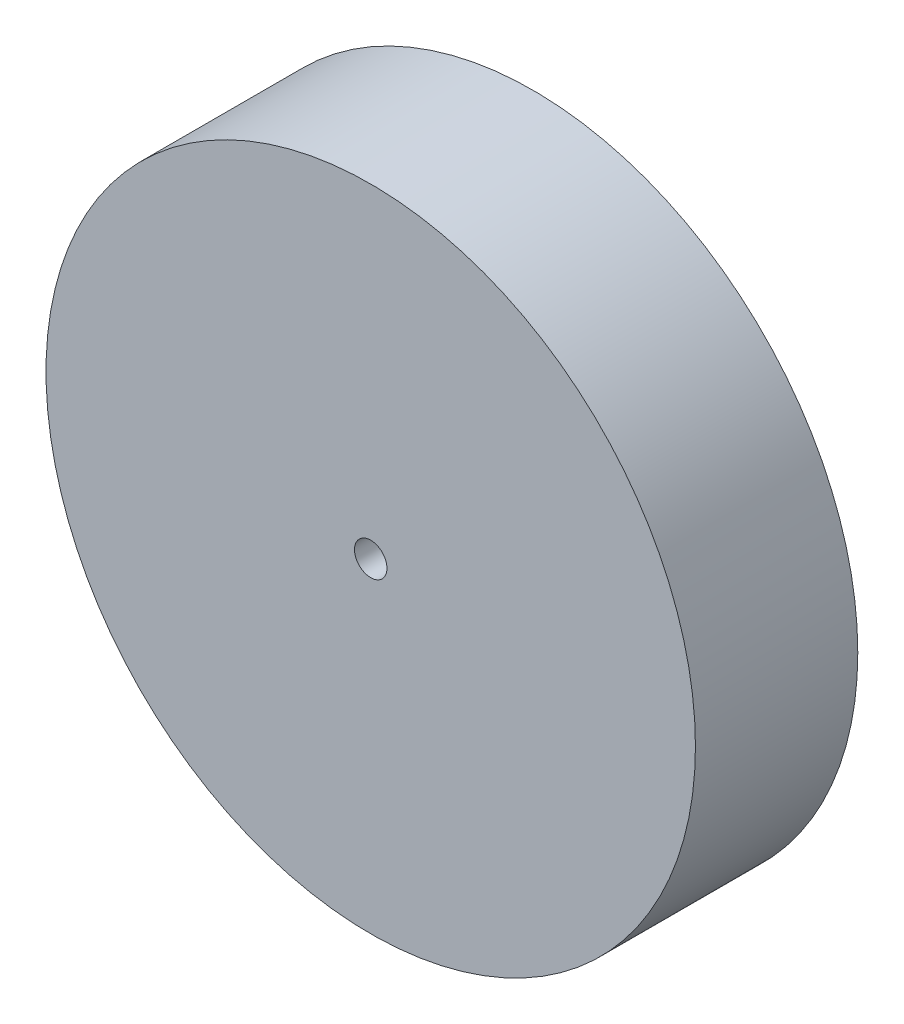
ISO-10303-21;
HEADER;
FILE_DESCRIPTION(('STEP AP214'),'2;1');
FILE_NAME('part.step','',(''),(''),'','','');
FILE_SCHEMA(('AUTOMOTIVE_DESIGN { 1 0 10303 214 1 1 1 1 }'));
ENDSEC;
DATA;
#1=APPLICATION_CONTEXT('core data for automotive mechanical design processes');
#2=APPLICATION_PROTOCOL_DEFINITION('international standard','automotive_design',2000,#1);
#3=PRODUCT_CONTEXT('',#1,'mechanical');
#4=PRODUCT('Part','Part','',(#3));
#5=PRODUCT_RELATED_PRODUCT_CATEGORY('part','',(#4));
#6=PRODUCT_DEFINITION_FORMATION('','',#4);
#7=PRODUCT_DEFINITION_CONTEXT('part definition',#1,'design');
#8=PRODUCT_DEFINITION('design','',#6,#7);
#9=PRODUCT_DEFINITION_SHAPE('','',#8);
#10=(LENGTH_UNIT() NAMED_UNIT(*) SI_UNIT(.MILLI.,.METRE.));
#11=(NAMED_UNIT(*) PLANE_ANGLE_UNIT() SI_UNIT($,.RADIAN.));
#12=(NAMED_UNIT(*) SI_UNIT($,.STERADIAN.) SOLID_ANGLE_UNIT());
#13=UNCERTAINTY_MEASURE_WITH_UNIT(LENGTH_MEASURE(1.E-05),#10,'distance_accuracy_value','');
#14=(GEOMETRIC_REPRESENTATION_CONTEXT(3) GLOBAL_UNCERTAINTY_ASSIGNED_CONTEXT((#13)) GLOBAL_UNIT_ASSIGNED_CONTEXT((#10,
#11,#12)) REPRESENTATION_CONTEXT('',''));
#15=CARTESIAN_POINT('',(0.,0.,0.));
#16=DIRECTION('',(0.,0.,1.));
#17=DIRECTION('',(1.,0.,0.));
#18=AXIS2_PLACEMENT_3D('',#15,#16,#17);
#19=CARTESIAN_POINT('',(0.,0.,0.));
#20=DIRECTION('',(0.,0.,1.));
#21=DIRECTION('',(1.,0.,0.));
#22=AXIS2_PLACEMENT_3D('',#19,#20,#21);
#23=CYLINDRICAL_SURFACE('',#22,0.5);
#24=CARTESIAN_POINT('',(0.,0.,5.));
#25=DIRECTION('',(0.,0.,1.));
#26=DIRECTION('',(1.,0.,0.));
#27=AXIS2_PLACEMENT_3D('',#24,#25,#26);
#28=CIRCLE('',#27,0.5);
#29=CARTESIAN_POINT('',(0.5,0.,5.));
#30=VERTEX_POINT('',#29);
#31=EDGE_CURVE('E58',#30,#30,#28,.T.);
#32=ORIENTED_EDGE('',*,*,#31,.T.);
#33=EDGE_LOOP('',(#32));
#34=FACE_BOUND('',#33,.T.);
#35=CARTESIAN_POINT('',(0.,0.,0.2));
#36=DIRECTION('',(0.,0.,-1.));
#37=DIRECTION('',(-1.,0.,0.));
#38=AXIS2_PLACEMENT_3D('',#35,#36,#37);
#39=CIRCLE('',#38,0.5);
#40=CARTESIAN_POINT('',(-0.5,0.,0.2));
#41=VERTEX_POINT('',#40);
#42=EDGE_CURVE('E49',#41,#41,#39,.F.);
#43=ORIENTED_EDGE('',*,*,#42,.F.);
#44=EDGE_LOOP('',(#43));
#45=FACE_BOUND('',#44,.T.);
#46=ADVANCED_FACE('F45',(#34,#45),#23,.F.);
#47=CARTESIAN_POINT('',(0.,0.,5.));
#48=DIRECTION('',(0.,0.,-1.));
#49=DIRECTION('',(-1.,0.,0.));
#50=AXIS2_PLACEMENT_3D('',#47,#48,#49);
#51=CYLINDRICAL_SURFACE('',#50,10.);
#52=CARTESIAN_POINT('',(0.,0.,5.));
#53=DIRECTION('',(0.,0.,1.));
#54=DIRECTION('',(1.,0.,0.));
#55=AXIS2_PLACEMENT_3D('',#52,#53,#54);
#56=CIRCLE('',#55,10.);
#57=CARTESIAN_POINT('',(10.,0.,5.));
#58=VERTEX_POINT('',#57);
#59=EDGE_CURVE('E12',#58,#58,#56,.T.);
#60=ORIENTED_EDGE('',*,*,#59,.F.);
#61=EDGE_LOOP('',(#60));
#62=FACE_BOUND('',#61,.T.);
#63=CARTESIAN_POINT('',(0.,0.,0.));
#64=DIRECTION('',(0.,0.,1.));
#65=DIRECTION('',(1.,0.,0.));
#66=AXIS2_PLACEMENT_3D('',#63,#64,#65);
#67=CIRCLE('',#66,10.);
#68=CARTESIAN_POINT('',(10.,0.,0.));
#69=VERTEX_POINT('',#68);
#70=EDGE_CURVE('E53',#69,#69,#67,.T.);
#71=ORIENTED_EDGE('',*,*,#70,.T.);
#72=EDGE_LOOP('',(#71));
#73=FACE_BOUND('',#72,.T.);
#74=ADVANCED_FACE('F47',(#62,#73),#51,.T.);
#75=CARTESIAN_POINT('',(0.,0.,5.));
#76=DIRECTION('',(0.,0.,1.));
#77=DIRECTION('',(1.,0.,0.));
#78=AXIS2_PLACEMENT_3D('',#75,#76,#77);
#79=PLANE('',#78);
#80=ORIENTED_EDGE('',*,*,#31,.F.);
#81=EDGE_LOOP('',(#80));
#82=FACE_BOUND('',#81,.T.);
#83=ORIENTED_EDGE('',*,*,#59,.T.);
#84=EDGE_LOOP('',(#83));
#85=FACE_BOUND('',#84,.T.);
#86=ADVANCED_FACE('F80',(#82,#85),#79,.T.);
#87=CARTESIAN_POINT('',(0.,0.,0.));
#88=DIRECTION('',(0.,0.,1.));
#89=DIRECTION('',(1.,0.,0.));
#90=AXIS2_PLACEMENT_3D('',#87,#88,#89);
#91=PLANE('',#90);
#92=CARTESIAN_POINT('',(0.,0.,0.));
#93=DIRECTION('',(0.,0.,-1.));
#94=DIRECTION('',(-1.,0.,0.));
#95=AXIS2_PLACEMENT_3D('',#92,#93,#94);
#96=CIRCLE('',#95,1.7);
#97=CARTESIAN_POINT('',(-1.7,0.,0.));
#98=VERTEX_POINT('',#97);
#99=EDGE_CURVE('E62',#98,#98,#96,.T.);
#100=ORIENTED_EDGE('',*,*,#99,.F.);
#101=EDGE_LOOP('',(#100));
#102=FACE_BOUND('',#101,.T.);
#103=ORIENTED_EDGE('',*,*,#70,.F.);
#104=EDGE_LOOP('',(#103));
#105=FACE_BOUND('',#104,.T.);
#106=ADVANCED_FACE('F87',(#102,#105),#91,.F.);
#107=CARTESIAN_POINT('',(0.,0.,0.2));
#108=DIRECTION('',(0.,0.,-1.));
#109=DIRECTION('',(-1.,0.,0.));
#110=AXIS2_PLACEMENT_3D('',#107,#108,#109);
#111=PLANE('',#110);
#112=CARTESIAN_POINT('',(0.,0.,0.2));
#113=DIRECTION('',(0.,0.,-1.));
#114=DIRECTION('',(-1.,0.,0.));
#115=AXIS2_PLACEMENT_3D('',#112,#113,#114);
#116=CIRCLE('',#115,1.7);
#117=CARTESIAN_POINT('',(-1.7,0.,0.2));
#118=VERTEX_POINT('',#117);
#119=EDGE_CURVE('E65',#118,#118,#116,.T.);
#120=ORIENTED_EDGE('',*,*,#119,.T.);
#121=EDGE_LOOP('',(#120));
#122=FACE_BOUND('',#121,.T.);
#123=ORIENTED_EDGE('',*,*,#42,.T.);
#124=EDGE_LOOP('',(#123));
#125=FACE_BOUND('',#124,.T.);
#126=ADVANCED_FACE('F72',(#122,#125),#111,.T.);
#127=CARTESIAN_POINT('',(0.,0.,0.2));
#128=DIRECTION('',(0.,0.,-1.));
#129=DIRECTION('',(-1.,0.,0.));
#130=AXIS2_PLACEMENT_3D('',#127,#128,#129);
#131=CYLINDRICAL_SURFACE('',#130,1.7);
#132=ORIENTED_EDGE('',*,*,#119,.F.);
#133=EDGE_LOOP('',(#132));
#134=FACE_BOUND('',#133,.T.);
#135=ORIENTED_EDGE('',*,*,#99,.T.);
#136=EDGE_LOOP('',(#135));
#137=FACE_BOUND('',#136,.T.);
#138=ADVANCED_FACE('F84',(#134,#137),#131,.F.);
#139=CLOSED_SHELL('',(#46,#74,#86,#106,#126,#138));
#140=MANIFOLD_SOLID_BREP('B2',#139);
#141=ADVANCED_BREP_SHAPE_REPRESENTATION('',(#18,#140),#14);
#142=SHAPE_DEFINITION_REPRESENTATION(#9,#141);
ENDSEC;
END-ISO-10303-21;
